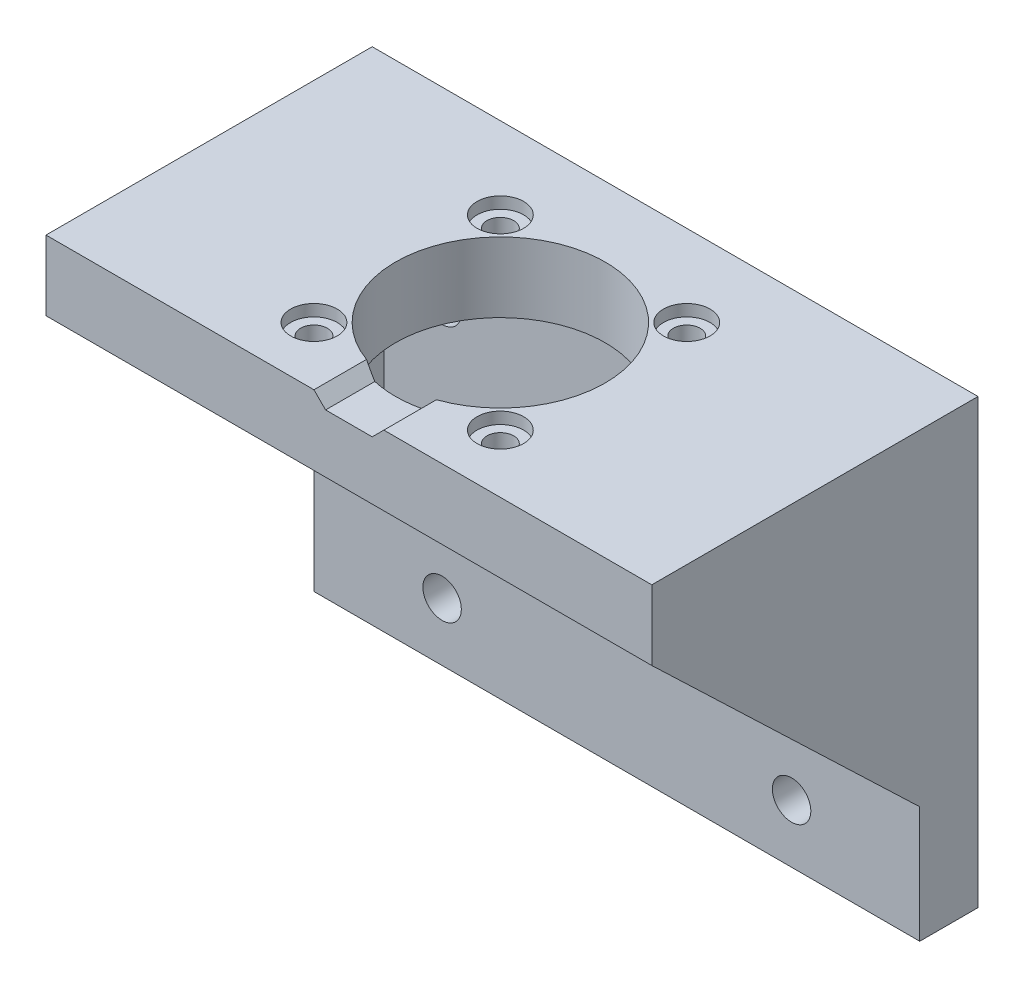
ISO-10303-21;
HEADER;
FILE_DESCRIPTION(('STEP AP214'),'2;1');
FILE_NAME('part.step','',(''),(''),'','','');
FILE_SCHEMA(('AUTOMOTIVE_DESIGN { 1 0 10303 214 1 1 1 1 }'));
ENDSEC;
DATA;
#1=APPLICATION_CONTEXT('core data for automotive mechanical design processes');
#2=APPLICATION_PROTOCOL_DEFINITION('international standard','automotive_design',2000,#1);
#3=PRODUCT_CONTEXT('',#1,'mechanical');
#4=PRODUCT('Part','Part','',(#3));
#5=PRODUCT_RELATED_PRODUCT_CATEGORY('part','',(#4));
#6=PRODUCT_DEFINITION_FORMATION('','',#4);
#7=PRODUCT_DEFINITION_CONTEXT('part definition',#1,'design');
#8=PRODUCT_DEFINITION('design','',#6,#7);
#9=PRODUCT_DEFINITION_SHAPE('','',#8);
#10=(LENGTH_UNIT() NAMED_UNIT(*) SI_UNIT(.MILLI.,.METRE.));
#11=(NAMED_UNIT(*) PLANE_ANGLE_UNIT() SI_UNIT($,.RADIAN.));
#12=(NAMED_UNIT(*) SI_UNIT($,.STERADIAN.) SOLID_ANGLE_UNIT());
#13=UNCERTAINTY_MEASURE_WITH_UNIT(LENGTH_MEASURE(1.E-05),#10,'distance_accuracy_value','');
#14=(GEOMETRIC_REPRESENTATION_CONTEXT(3) GLOBAL_UNCERTAINTY_ASSIGNED_CONTEXT((#13)) GLOBAL_UNIT_ASSIGNED_CONTEXT((#10,
#11,#12)) REPRESENTATION_CONTEXT('',''));
#15=CARTESIAN_POINT('',(0.,0.,0.));
#16=DIRECTION('',(0.,0.,1.));
#17=DIRECTION('',(1.,0.,0.));
#18=AXIS2_PLACEMENT_3D('',#15,#16,#17);
#19=CARTESIAN_POINT('',(-65.9140805289121,124.989928324475,23.0000999999999));
#20=DIRECTION('',(0.,-1.,0.));
#21=DIRECTION('',(0.,0.,-1.));
#22=AXIS2_PLACEMENT_3D('',#19,#20,#21);
#23=CYLINDRICAL_SURFACE('',#22,1.15);
#24=CARTESIAN_POINT('',(-65.9140805289121,115.737237131017,23.0000999999999));
#25=DIRECTION('',(0.,-1.,0.));
#26=DIRECTION('',(0.,0.,-1.));
#27=AXIS2_PLACEMENT_3D('',#24,#25,#26);
#28=CIRCLE('',#27,1.15);
#29=CARTESIAN_POINT('',(-65.9140805289121,115.737237131017,21.8500999999999));
#30=VERTEX_POINT('',#29);
#31=EDGE_CURVE('E234',#30,#30,#28,.T.);
#32=ORIENTED_EDGE('',*,*,#31,.T.);
#33=EDGE_LOOP('',(#32));
#34=FACE_BOUND('',#33,.T.);
#35=CARTESIAN_POINT('',(-65.9140805289121,120.737237131017,23.0000999999999));
#36=DIRECTION('',(0.,1.,0.));
#37=DIRECTION('',(0.,0.,1.));
#38=AXIS2_PLACEMENT_3D('',#35,#36,#37);
#39=CIRCLE('',#38,1.15);
#40=CARTESIAN_POINT('',(-65.9140805289121,120.737237131017,24.1500999999999));
#41=VERTEX_POINT('',#40);
#42=EDGE_CURVE('E43',#41,#41,#39,.F.);
#43=ORIENTED_EDGE('',*,*,#42,.F.);
#44=EDGE_LOOP('',(#43));
#45=FACE_BOUND('',#44,.T.);
#46=ADVANCED_FACE('F39',(#34,#45),#23,.F.);
#47=CARTESIAN_POINT('',(-49.9140805289121,124.989928324475,23.0000999999999));
#48=DIRECTION('',(0.,-1.,0.));
#49=DIRECTION('',(0.,0.,-1.));
#50=AXIS2_PLACEMENT_3D('',#47,#48,#49);
#51=CYLINDRICAL_SURFACE('',#50,1.15);
#52=CARTESIAN_POINT('',(-49.9140805289121,115.737237131017,23.0000999999999));
#53=DIRECTION('',(0.,-1.,0.));
#54=DIRECTION('',(0.,0.,-1.));
#55=AXIS2_PLACEMENT_3D('',#52,#53,#54);
#56=CIRCLE('',#55,1.15);
#57=CARTESIAN_POINT('',(-49.9140805289121,115.737237131017,21.8500999999999));
#58=VERTEX_POINT('',#57);
#59=EDGE_CURVE('E231',#58,#58,#56,.T.);
#60=ORIENTED_EDGE('',*,*,#59,.T.);
#61=EDGE_LOOP('',(#60));
#62=FACE_BOUND('',#61,.T.);
#63=CARTESIAN_POINT('',(-49.9140805289121,120.737237131017,23.0000999999999));
#64=DIRECTION('',(0.,1.,0.));
#65=DIRECTION('',(0.,0.,1.));
#66=AXIS2_PLACEMENT_3D('',#63,#64,#65);
#67=CIRCLE('',#66,1.15);
#68=CARTESIAN_POINT('',(-49.9140805289121,120.737237131017,24.1500999999999));
#69=VERTEX_POINT('',#68);
#70=EDGE_CURVE('E294',#69,#69,#67,.F.);
#71=ORIENTED_EDGE('',*,*,#70,.F.);
#72=EDGE_LOOP('',(#71));
#73=FACE_BOUND('',#72,.T.);
#74=ADVANCED_FACE('F304',(#62,#73),#51,.F.);
#75=CARTESIAN_POINT('',(-49.9140805289121,124.989928324475,7.00009999999994));
#76=DIRECTION('',(0.,-1.,0.));
#77=DIRECTION('',(0.,0.,-1.));
#78=AXIS2_PLACEMENT_3D('',#75,#76,#77);
#79=CYLINDRICAL_SURFACE('',#78,1.15);
#80=CARTESIAN_POINT('',(-49.9140805289121,115.737237131017,7.00009999999994));
#81=DIRECTION('',(0.,-1.,0.));
#82=DIRECTION('',(0.,0.,-1.));
#83=AXIS2_PLACEMENT_3D('',#80,#81,#82);
#84=CIRCLE('',#83,1.15);
#85=CARTESIAN_POINT('',(-49.9140805289121,115.737237131017,5.85009999999994));
#86=VERTEX_POINT('',#85);
#87=EDGE_CURVE('E235',#86,#86,#84,.T.);
#88=ORIENTED_EDGE('',*,*,#87,.T.);
#89=EDGE_LOOP('',(#88));
#90=FACE_BOUND('',#89,.T.);
#91=CARTESIAN_POINT('',(-49.9140805289121,120.737237131017,7.00009999999994));
#92=DIRECTION('',(0.,1.,0.));
#93=DIRECTION('',(0.,0.,1.));
#94=AXIS2_PLACEMENT_3D('',#91,#92,#93);
#95=CIRCLE('',#94,1.15);
#96=CARTESIAN_POINT('',(-49.9140805289121,120.737237131017,8.15009999999994));
#97=VERTEX_POINT('',#96);
#98=EDGE_CURVE('E291',#97,#97,#95,.F.);
#99=ORIENTED_EDGE('',*,*,#98,.F.);
#100=EDGE_LOOP('',(#99));
#101=FACE_BOUND('',#100,.T.);
#102=ADVANCED_FACE('F311',(#90,#101),#79,.F.);
#103=CARTESIAN_POINT('',(-65.9140805289121,124.989928324475,7.00009999999994));
#104=DIRECTION('',(0.,-1.,0.));
#105=DIRECTION('',(0.,0.,-1.));
#106=AXIS2_PLACEMENT_3D('',#103,#104,#105);
#107=CYLINDRICAL_SURFACE('',#106,1.15);
#108=CARTESIAN_POINT('',(-65.9140805289121,115.737237131017,7.00009999999994));
#109=DIRECTION('',(0.,-1.,0.));
#110=DIRECTION('',(0.,0.,-1.));
#111=AXIS2_PLACEMENT_3D('',#108,#109,#110);
#112=CIRCLE('',#111,1.15);
#113=CARTESIAN_POINT('',(-65.9140805289121,115.737237131017,5.85009999999994));
#114=VERTEX_POINT('',#113);
#115=EDGE_CURVE('E230',#114,#114,#112,.T.);
#116=ORIENTED_EDGE('',*,*,#115,.T.);
#117=EDGE_LOOP('',(#116));
#118=FACE_BOUND('',#117,.T.);
#119=CARTESIAN_POINT('',(-65.9140805289121,120.737237131017,7.00009999999994));
#120=DIRECTION('',(0.,1.,0.));
#121=DIRECTION('',(0.,0.,1.));
#122=AXIS2_PLACEMENT_3D('',#119,#120,#121);
#123=CIRCLE('',#122,1.15);
#124=CARTESIAN_POINT('',(-65.9140805289121,120.737237131017,8.15009999999994));
#125=VERTEX_POINT('',#124);
#126=EDGE_CURVE('E288',#125,#125,#123,.F.);
#127=ORIENTED_EDGE('',*,*,#126,.F.);
#128=EDGE_LOOP('',(#127));
#129=FACE_BOUND('',#128,.T.);
#130=ADVANCED_FACE('F316',(#118,#129),#107,.F.);
#131=CARTESIAN_POINT('',(0.,0.,5.));
#132=DIRECTION('',(0.,0.,1.));
#133=DIRECTION('',(1.,0.,0.));
#134=AXIS2_PLACEMENT_3D('',#131,#132,#133);
#135=PLANE('',#134);
#136=CARTESIAN_POINT('',(-72.9141805289121,99.737237131017,5.));
#137=DIRECTION('',(0.,0.,1.));
#138=DIRECTION('',(1.,0.,0.));
#139=AXIS2_PLACEMENT_3D('',#136,#137,#138);
#140=CIRCLE('',#139,1.65);
#141=CARTESIAN_POINT('',(-71.2641805289121,99.737237131017,5.));
#142=VERTEX_POINT('',#141);
#143=EDGE_CURVE('E167',#142,#142,#140,.T.);
#144=ORIENTED_EDGE('',*,*,#143,.F.);
#145=EDGE_LOOP('',(#144));
#146=FACE_BOUND('',#145,.T.);
#147=CARTESIAN_POINT('',(-42.9141805289121,99.737237131017,5.));
#148=DIRECTION('',(0.,0.,1.));
#149=DIRECTION('',(1.,0.,0.));
#150=AXIS2_PLACEMENT_3D('',#147,#148,#149);
#151=CIRCLE('',#150,1.65);
#152=CARTESIAN_POINT('',(-41.2641805289121,99.737237131017,5.));
#153=VERTEX_POINT('',#152);
#154=EDGE_CURVE('E158',#153,#153,#151,.T.);
#155=ORIENTED_EDGE('',*,*,#154,.F.);
#156=EDGE_LOOP('',(#155));
#157=FACE_BOUND('',#156,.T.);
#158=CARTESIAN_POINT('',(-42.9141805289121,88.737237131017,5.));
#159=DIRECTION('',(0.,0.,1.));
#160=DIRECTION('',(1.,0.,0.));
#161=AXIS2_PLACEMENT_3D('',#158,#159,#160);
#162=CIRCLE('',#161,1.65);
#163=CARTESIAN_POINT('',(-41.2641805289121,88.737237131017,5.));
#164=VERTEX_POINT('',#163);
#165=EDGE_CURVE('E185',#164,#164,#162,.T.);
#166=ORIENTED_EDGE('',*,*,#165,.F.);
#167=EDGE_LOOP('',(#166));
#168=FACE_BOUND('',#167,.T.);
#169=CARTESIAN_POINT('',(-72.9141805289121,110.737237131017,5.));
#170=DIRECTION('',(0.,0.,1.));
#171=DIRECTION('',(1.,0.,0.));
#172=AXIS2_PLACEMENT_3D('',#169,#170,#171);
#173=CIRCLE('',#172,1.65);
#174=CARTESIAN_POINT('',(-71.2641805289121,110.737237131017,5.));
#175=VERTEX_POINT('',#174);
#176=EDGE_CURVE('E178',#175,#175,#173,.T.);
#177=ORIENTED_EDGE('',*,*,#176,.F.);
#178=EDGE_LOOP('',(#177));
#179=FACE_BOUND('',#178,.T.);
#180=CARTESIAN_POINT('',(-72.9141805289121,88.737237131017,5.));
#181=DIRECTION('',(0.,0.,1.));
#182=DIRECTION('',(1.,0.,0.));
#183=AXIS2_PLACEMENT_3D('',#180,#181,#182);
#184=CIRCLE('',#183,1.65);
#185=CARTESIAN_POINT('',(-71.2641805289121,88.737237131017,5.));
#186=VERTEX_POINT('',#185);
#187=EDGE_CURVE('E166',#186,#186,#184,.T.);
#188=ORIENTED_EDGE('',*,*,#187,.F.);
#189=EDGE_LOOP('',(#188));
#190=FACE_BOUND('',#189,.T.);
#191=CARTESIAN_POINT('',(-42.9141805289121,110.737237131017,5.));
#192=DIRECTION('',(0.,0.,1.));
#193=DIRECTION('',(1.,0.,0.));
#194=AXIS2_PLACEMENT_3D('',#191,#192,#193);
#195=CIRCLE('',#194,1.65);
#196=CARTESIAN_POINT('',(-41.2641805289121,110.737237131017,5.));
#197=VERTEX_POINT('',#196);
#198=EDGE_CURVE('E184',#197,#197,#195,.T.);
#199=ORIENTED_EDGE('',*,*,#198,.F.);
#200=EDGE_LOOP('',(#199));
#201=FACE_BOUND('',#200,.T.);
#202=DIRECTION('',(0.,1.,0.));
#203=VECTOR('',#202,1.);
#204=CARTESIAN_POINT('',(-77.9141805289121,83.737237131017,5.));
#205=LINE('',#204,#203);
#206=CARTESIAN_POINT('',(-77.9141805289121,93.737237131017,5.));
#207=VERTEX_POINT('',#206);
#208=CARTESIAN_POINT('',(-77.9141805289121,115.737237131017,5.));
#209=VERTEX_POINT('',#208);
#210=EDGE_CURVE('E224',#207,#209,#205,.T.);
#211=ORIENTED_EDGE('',*,*,#210,.F.);
#212=DIRECTION('',(-1.,0.,0.));
#213=VECTOR('',#212,1.);
#214=CARTESIAN_POINT('',(-31.9141805289121,93.737237131017,5.));
#215=LINE('',#214,#213);
#216=CARTESIAN_POINT('',(-83.9141805289121,93.737237131017,5.));
#217=VERTEX_POINT('',#216);
#218=EDGE_CURVE('E215',#207,#217,#215,.T.);
#219=ORIENTED_EDGE('',*,*,#218,.T.);
#220=DIRECTION('',(0.,-1.,0.));
#221=VECTOR('',#220,1.);
#222=CARTESIAN_POINT('',(-83.9141805289121,83.737237131017,5.));
#223=LINE('',#222,#221);
#224=CARTESIAN_POINT('',(-83.9141805289121,83.737237131017,5.));
#225=VERTEX_POINT('',#224);
#226=EDGE_CURVE('E203',#217,#225,#223,.T.);
#227=ORIENTED_EDGE('',*,*,#226,.T.);
#228=DIRECTION('',(1.,0.,0.));
#229=VECTOR('',#228,1.);
#230=CARTESIAN_POINT('',(-83.9141805289121,83.737237131017,5.));
#231=LINE('',#230,#229);
#232=CARTESIAN_POINT('',(-31.9141805289121,83.737237131017,5.));
#233=VERTEX_POINT('',#232);
#234=EDGE_CURVE('E257',#225,#233,#231,.T.);
#235=ORIENTED_EDGE('',*,*,#234,.T.);
#236=DIRECTION('',(0.,-1.,0.));
#237=VECTOR('',#236,1.);
#238=CARTESIAN_POINT('',(-31.9141805289121,79.1510465858226,5.));
#239=LINE('',#238,#237);
#240=CARTESIAN_POINT('',(-31.9141805289121,93.737237131017,5.));
#241=VERTEX_POINT('',#240);
#242=EDGE_CURVE('E199',#241,#233,#239,.T.);
#243=ORIENTED_EDGE('',*,*,#242,.F.);
#244=CARTESIAN_POINT('',(-37.9141805289121,93.737237131017,5.));
#245=VERTEX_POINT('',#244);
#246=EDGE_CURVE('E211',#241,#245,#215,.T.);
#247=ORIENTED_EDGE('',*,*,#246,.T.);
#248=DIRECTION('',(0.,-1.,0.));
#249=VECTOR('',#248,1.);
#250=CARTESIAN_POINT('',(-37.9141805289121,83.737237131017,5.));
#251=LINE('',#250,#249);
#252=CARTESIAN_POINT('',(-37.9141805289121,115.737237131017,5.));
#253=VERTEX_POINT('',#252);
#254=EDGE_CURVE('E221',#253,#245,#251,.T.);
#255=ORIENTED_EDGE('',*,*,#254,.F.);
#256=DIRECTION('',(1.,0.,0.));
#257=VECTOR('',#256,1.);
#258=CARTESIAN_POINT('',(-83.9141805289121,115.737237131017,5.));
#259=LINE('',#258,#257);
#260=EDGE_CURVE('E247',#209,#253,#259,.T.);
#261=ORIENTED_EDGE('',*,*,#260,.F.);
#262=EDGE_LOOP('',(#211,#219,#227,#235,#243,#247,#255,#261));
#263=FACE_BOUND('',#262,.T.);
#264=ADVANCED_FACE('F330',(#146,#157,#168,#179,#190,#201,#263),#135,.T.);
#265=CARTESIAN_POINT('',(-83.9141805289121,115.737237131017,28.));
#266=DIRECTION('',(0.,1.,0.));
#267=DIRECTION('',(0.,0.,1.));
#268=AXIS2_PLACEMENT_3D('',#265,#266,#267);
#269=PLANE('',#268);
#270=ORIENTED_EDGE('',*,*,#115,.F.);
#271=EDGE_LOOP('',(#270));
#272=FACE_BOUND('',#271,.T.);
#273=ORIENTED_EDGE('',*,*,#87,.F.);
#274=EDGE_LOOP('',(#273));
#275=FACE_BOUND('',#274,.T.);
#276=ORIENTED_EDGE('',*,*,#59,.F.);
#277=EDGE_LOOP('',(#276));
#278=FACE_BOUND('',#277,.T.);
#279=ORIENTED_EDGE('',*,*,#31,.F.);
#280=EDGE_LOOP('',(#279));
#281=FACE_BOUND('',#280,.T.);
#282=CARTESIAN_POINT('',(-57.9140805289121,115.737237131017,15.0001));
#283=DIRECTION('',(0.,1.,0.));
#284=DIRECTION('',(0.,0.,1.));
#285=AXIS2_PLACEMENT_3D('',#282,#283,#284);
#286=CIRCLE('',#285,9.00000000000001);
#287=CARTESIAN_POINT('',(-57.9140805289121,115.737237131017,24.0001));
#288=VERTEX_POINT('',#287);
#289=EDGE_CURVE('E244',#288,#288,#286,.F.);
#290=ORIENTED_EDGE('',*,*,#289,.F.);
#291=EDGE_LOOP('',(#290));
#292=FACE_BOUND('',#291,.T.);
#293=DIRECTION('',(0.,0.,-1.));
#294=VECTOR('',#293,1.);
#295=CARTESIAN_POINT('',(-37.9141805289121,115.737237131017,60.5576411921994));
#296=LINE('',#295,#294);
#297=CARTESIAN_POINT('',(-37.9141805289121,115.737237131017,28.));
#298=VERTEX_POINT('',#297);
#299=EDGE_CURVE('E220',#298,#253,#296,.T.);
#300=ORIENTED_EDGE('',*,*,#299,.F.);
#301=DIRECTION('',(1.,0.,0.));
#302=VECTOR('',#301,1.);
#303=CARTESIAN_POINT('',(-83.9141805289121,115.737237131017,28.));
#304=LINE('',#303,#302);
#305=CARTESIAN_POINT('',(-77.9141805289121,115.737237131017,28.));
#306=VERTEX_POINT('',#305);
#307=EDGE_CURVE('E250',#306,#298,#304,.T.);
#308=ORIENTED_EDGE('',*,*,#307,.F.);
#309=DIRECTION('',(0.,0.,-1.));
#310=VECTOR('',#309,1.);
#311=CARTESIAN_POINT('',(-77.9141805289121,115.737237131017,60.5576411921994));
#312=LINE('',#311,#310);
#313=EDGE_CURVE('E227',#306,#209,#312,.T.);
#314=ORIENTED_EDGE('',*,*,#313,.T.);
#315=ORIENTED_EDGE('',*,*,#260,.T.);
#316=EDGE_LOOP('',(#300,#308,#314,#315));
#317=FACE_BOUND('',#316,.T.);
#318=ADVANCED_FACE('F326',(#272,#275,#278,#281,#292,#317),#269,.F.);
#319=CARTESIAN_POINT('',(-83.9141805289121,121.737237131017,5.));
#320=DIRECTION('',(1.,0.,0.));
#321=DIRECTION('',(0.,0.,-1.));
#322=AXIS2_PLACEMENT_3D('',#319,#320,#321);
#323=PLANE('',#322);
#324=DIRECTION('',(0.,0.,-1.));
#325=VECTOR('',#324,1.);
#326=CARTESIAN_POINT('',(-83.9141805289121,83.737237131017,5.));
#327=LINE('',#326,#325);
#328=CARTESIAN_POINT('',(-83.9141805289121,83.737237131017,0.));
#329=VERTEX_POINT('',#328);
#330=EDGE_CURVE('E274',#225,#329,#327,.T.);
#331=ORIENTED_EDGE('',*,*,#330,.F.);
#332=ORIENTED_EDGE('',*,*,#226,.F.);
#333=DIRECTION('',(0.,-0.691222645967364,-0.722641857147699));
#334=VECTOR('',#333,1.);
#335=CARTESIAN_POINT('',(-83.9141805289121,93.737237131017,5.));
#336=LINE('',#335,#334);
#337=CARTESIAN_POINT('',(-83.9141805289121,115.737237131017,28.));
#338=VERTEX_POINT('',#337);
#339=EDGE_CURVE('E196',#338,#217,#336,.T.);
#340=ORIENTED_EDGE('',*,*,#339,.F.);
#341=DIRECTION('',(0.,-1.,0.));
#342=VECTOR('',#341,1.);
#343=CARTESIAN_POINT('',(-83.9141805289121,121.737237131017,28.));
#344=LINE('',#343,#342);
#345=CARTESIAN_POINT('',(-83.9141805289121,121.737237131017,28.));
#346=VERTEX_POINT('',#345);
#347=EDGE_CURVE('E248',#346,#338,#344,.T.);
#348=ORIENTED_EDGE('',*,*,#347,.F.);
#349=DIRECTION('',(0.,0.,-1.));
#350=VECTOR('',#349,1.);
#351=CARTESIAN_POINT('',(-83.9141805289121,121.737237131017,5.));
#352=LINE('',#351,#350);
#353=CARTESIAN_POINT('',(-83.9141805289121,121.737237131017,0.));
#354=VERTEX_POINT('',#353);
#355=EDGE_CURVE('E149',#346,#354,#352,.T.);
#356=ORIENTED_EDGE('',*,*,#355,.T.);
#357=DIRECTION('',(0.,-1.,0.));
#358=VECTOR('',#357,1.);
#359=CARTESIAN_POINT('',(-83.9141805289121,121.737237131017,0.));
#360=LINE('',#359,#358);
#361=EDGE_CURVE('E254',#354,#329,#360,.T.);
#362=ORIENTED_EDGE('',*,*,#361,.T.);
#363=EDGE_LOOP('',(#331,#332,#340,#348,#356,#362));
#364=FACE_BOUND('',#363,.T.);
#365=ADVANCED_FACE('F329',(#364),#323,.F.);
#366=CARTESIAN_POINT('',(-83.9141805289121,83.737237131017,5.));
#367=DIRECTION('',(0.,1.,0.));
#368=DIRECTION('',(0.,0.,1.));
#369=AXIS2_PLACEMENT_3D('',#366,#367,#368);
#370=PLANE('',#369);
#371=DIRECTION('',(0.,0.,-1.));
#372=VECTOR('',#371,1.);
#373=CARTESIAN_POINT('',(-31.9141805289121,83.737237131017,5.));
#374=LINE('',#373,#372);
#375=CARTESIAN_POINT('',(-31.9141805289121,83.737237131017,0.));
#376=VERTEX_POINT('',#375);
#377=EDGE_CURVE('E272',#233,#376,#374,.T.);
#378=ORIENTED_EDGE('',*,*,#377,.F.);
#379=ORIENTED_EDGE('',*,*,#234,.F.);
#380=ORIENTED_EDGE('',*,*,#330,.T.);
#381=DIRECTION('',(1.,0.,0.));
#382=VECTOR('',#381,1.);
#383=CARTESIAN_POINT('',(-83.9141805289121,83.737237131017,0.));
#384=LINE('',#383,#382);
#385=EDGE_CURVE('E262',#329,#376,#384,.T.);
#386=ORIENTED_EDGE('',*,*,#385,.T.);
#387=EDGE_LOOP('',(#378,#379,#380,#386));
#388=FACE_BOUND('',#387,.T.);
#389=ADVANCED_FACE('F344',(#388),#370,.F.);
#390=CARTESIAN_POINT('',(-31.9141805289122,121.737237131017,5.));
#391=DIRECTION('',(-1.,0.,0.));
#392=DIRECTION('',(0.,-1.,0.));
#393=AXIS2_PLACEMENT_3D('',#390,#391,#392);
#394=PLANE('',#393);
#395=DIRECTION('',(0.,-0.691222645967364,-0.722641857147699));
#396=VECTOR('',#395,1.);
#397=CARTESIAN_POINT('',(-31.9141805289121,93.737237131017,5.));
#398=LINE('',#397,#396);
#399=CARTESIAN_POINT('',(-31.9141805289121,115.737237131017,28.));
#400=VERTEX_POINT('',#399);
#401=EDGE_CURVE('E202',#400,#241,#398,.T.);
#402=ORIENTED_EDGE('',*,*,#401,.T.);
#403=ORIENTED_EDGE('',*,*,#242,.T.);
#404=ORIENTED_EDGE('',*,*,#377,.T.);
#405=DIRECTION('',(0.,1.,0.));
#406=VECTOR('',#405,1.);
#407=CARTESIAN_POINT('',(-31.9141805289122,121.737237131017,0.));
#408=LINE('',#407,#406);
#409=CARTESIAN_POINT('',(-31.9141805289122,121.737237131017,0.));
#410=VERTEX_POINT('',#409);
#411=EDGE_CURVE('E265',#376,#410,#408,.T.);
#412=ORIENTED_EDGE('',*,*,#411,.T.);
#413=DIRECTION('',(0.,0.,-1.));
#414=VECTOR('',#413,1.);
#415=CARTESIAN_POINT('',(-31.9141805289122,121.737237131017,5.));
#416=LINE('',#415,#414);
#417=CARTESIAN_POINT('',(-31.9141805289121,121.737237131017,28.));
#418=VERTEX_POINT('',#417);
#419=EDGE_CURVE('E269',#418,#410,#416,.T.);
#420=ORIENTED_EDGE('',*,*,#419,.F.);
#421=DIRECTION('',(0.,1.,0.));
#422=VECTOR('',#421,1.);
#423=CARTESIAN_POINT('',(-31.9141805289121,121.737237131017,28.));
#424=LINE('',#423,#422);
#425=EDGE_CURVE('E152',#400,#418,#424,.T.);
#426=ORIENTED_EDGE('',*,*,#425,.F.);
#427=EDGE_LOOP('',(#402,#403,#404,#412,#420,#426));
#428=FACE_BOUND('',#427,.T.);
#429=ADVANCED_FACE('F340',(#428),#394,.F.);
#430=CARTESIAN_POINT('',(-83.9141805289121,121.737237131017,5.));
#431=DIRECTION('',(0.,-1.,0.));
#432=DIRECTION('',(0.,0.,-1.));
#433=AXIS2_PLACEMENT_3D('',#430,#431,#432);
#434=PLANE('',#433);
#435=CARTESIAN_POINT('',(-65.9140805289121,121.737237131017,23.0000999999999));
#436=DIRECTION('',(0.,1.,0.));
#437=DIRECTION('',(0.,0.,1.));
#438=AXIS2_PLACEMENT_3D('',#435,#436,#437);
#439=CIRCLE('',#438,2.);
#440=CARTESIAN_POINT('',(-65.9140805289121,121.737237131017,25.0000999999999));
#441=VERTEX_POINT('',#440);
#442=EDGE_CURVE('E455',#441,#441,#439,.T.);
#443=ORIENTED_EDGE('',*,*,#442,.F.);
#444=EDGE_LOOP('',(#443));
#445=FACE_BOUND('',#444,.T.);
#446=CARTESIAN_POINT('',(-49.9140805289121,121.737237131017,23.0000999999999));
#447=DIRECTION('',(0.,1.,0.));
#448=DIRECTION('',(0.,0.,1.));
#449=AXIS2_PLACEMENT_3D('',#446,#447,#448);
#450=CIRCLE('',#449,2.);
#451=CARTESIAN_POINT('',(-49.9140805289121,121.737237131017,25.0000999999999));
#452=VERTEX_POINT('',#451);
#453=EDGE_CURVE('E461',#452,#452,#450,.T.);
#454=ORIENTED_EDGE('',*,*,#453,.F.);
#455=EDGE_LOOP('',(#454));
#456=FACE_BOUND('',#455,.T.);
#457=CARTESIAN_POINT('',(-49.9140805289121,121.737237131017,7.00009999999994));
#458=DIRECTION('',(0.,1.,0.));
#459=DIRECTION('',(0.,0.,1.));
#460=AXIS2_PLACEMENT_3D('',#457,#458,#459);
#461=CIRCLE('',#460,2.);
#462=CARTESIAN_POINT('',(-49.9140805289121,121.737237131017,9.00009999999993));
#463=VERTEX_POINT('',#462);
#464=EDGE_CURVE('E467',#463,#463,#461,.T.);
#465=ORIENTED_EDGE('',*,*,#464,.F.);
#466=EDGE_LOOP('',(#465));
#467=FACE_BOUND('',#466,.T.);
#468=CARTESIAN_POINT('',(-65.9140805289121,121.737237131017,7.00009999999994));
#469=DIRECTION('',(0.,1.,0.));
#470=DIRECTION('',(0.,0.,1.));
#471=AXIS2_PLACEMENT_3D('',#468,#469,#470);
#472=CIRCLE('',#471,2.);
#473=CARTESIAN_POINT('',(-65.9140805289121,121.737237131017,9.00009999999994));
#474=VERTEX_POINT('',#473);
#475=EDGE_CURVE('E449',#474,#474,#472,.T.);
#476=ORIENTED_EDGE('',*,*,#475,.F.);
#477=EDGE_LOOP('',(#476));
#478=FACE_BOUND('',#477,.T.);
#479=CARTESIAN_POINT('',(-57.9140805289121,121.737237131017,15.0001));
#480=DIRECTION('',(0.,1.,0.));
#481=DIRECTION('',(0.,0.,1.));
#482=AXIS2_PLACEMENT_3D('',#479,#480,#481);
#483=CIRCLE('',#482,9.00000000000001);
#484=CARTESIAN_POINT('',(-54.9141805289121,121.737237131017,23.4854167289148));
#485=VERTEX_POINT('',#484);
#486=CARTESIAN_POINT('',(-60.9141805289121,121.737237131017,23.4853460182366));
#487=VERTEX_POINT('',#486);
#488=EDGE_CURVE('E242',#485,#487,#483,.T.);
#489=ORIENTED_EDGE('',*,*,#488,.F.);
#490=DIRECTION('',(0.,0.,-1.));
#491=VECTOR('',#490,1.);
#492=CARTESIAN_POINT('',(-54.9141805289121,121.737237131017,28.));
#493=LINE('',#492,#491);
#494=CARTESIAN_POINT('',(-54.9141805289121,121.737237131017,28.));
#495=VERTEX_POINT('',#494);
#496=EDGE_CURVE('E156',#495,#485,#493,.T.);
#497=ORIENTED_EDGE('',*,*,#496,.F.);
#498=DIRECTION('',(-1.,0.,0.));
#499=VECTOR('',#498,1.);
#500=CARTESIAN_POINT('',(-83.9141805289121,121.737237131017,28.));
#501=LINE('',#500,#499);
#502=EDGE_CURVE('E151',#418,#495,#501,.T.);
#503=ORIENTED_EDGE('',*,*,#502,.F.);
#504=ORIENTED_EDGE('',*,*,#419,.T.);
#505=DIRECTION('',(-1.,0.,0.));
#506=VECTOR('',#505,1.);
#507=CARTESIAN_POINT('',(-83.9141805289121,121.737237131017,0.));
#508=LINE('',#507,#506);
#509=EDGE_CURVE('E259',#410,#354,#508,.T.);
#510=ORIENTED_EDGE('',*,*,#509,.T.);
#511=ORIENTED_EDGE('',*,*,#355,.F.);
#512=CARTESIAN_POINT('',(-60.9141805289121,121.737237131017,28.));
#513=VERTEX_POINT('',#512);
#514=EDGE_CURVE('E137',#513,#346,#501,.T.);
#515=ORIENTED_EDGE('',*,*,#514,.F.);
#516=DIRECTION('',(0.,0.,1.));
#517=VECTOR('',#516,1.);
#518=CARTESIAN_POINT('',(-60.9141805289121,121.737237131017,28.));
#519=LINE('',#518,#517);
#520=EDGE_CURVE('E146',#487,#513,#519,.T.);
#521=ORIENTED_EDGE('',*,*,#520,.F.);
#522=EDGE_LOOP('',(#489,#497,#503,#504,#510,#511,#515,#521));
#523=FACE_BOUND('',#522,.T.);
#524=ADVANCED_FACE('F145',(#445,#456,#467,#478,#523),#434,.F.);
#525=CARTESIAN_POINT('',(0.,0.,0.));
#526=DIRECTION('',(0.,0.,1.));
#527=DIRECTION('',(1.,0.,0.));
#528=AXIS2_PLACEMENT_3D('',#525,#526,#527);
#529=PLANE('',#528);
#530=CARTESIAN_POINT('',(-72.9141805289121,99.737237131017,0.));
#531=DIRECTION('',(0.,0.,1.));
#532=DIRECTION('',(1.,0.,0.));
#533=AXIS2_PLACEMENT_3D('',#530,#531,#532);
#534=CIRCLE('',#533,1.65);
#535=CARTESIAN_POINT('',(-71.2641805289121,99.737237131017,0.));
#536=VERTEX_POINT('',#535);
#537=EDGE_CURVE('E163',#536,#536,#534,.T.);
#538=ORIENTED_EDGE('',*,*,#537,.T.);
#539=EDGE_LOOP('',(#538));
#540=FACE_BOUND('',#539,.T.);
#541=CARTESIAN_POINT('',(-42.9141805289121,99.737237131017,0.));
#542=DIRECTION('',(0.,0.,1.));
#543=DIRECTION('',(1.,0.,0.));
#544=AXIS2_PLACEMENT_3D('',#541,#542,#543);
#545=CIRCLE('',#544,1.65);
#546=CARTESIAN_POINT('',(-41.2641805289121,99.737237131017,0.));
#547=VERTEX_POINT('',#546);
#548=EDGE_CURVE('E170',#547,#547,#545,.T.);
#549=ORIENTED_EDGE('',*,*,#548,.T.);
#550=EDGE_LOOP('',(#549));
#551=FACE_BOUND('',#550,.T.);
#552=CARTESIAN_POINT('',(-42.9141805289121,88.737237131017,0.));
#553=DIRECTION('',(0.,0.,1.));
#554=DIRECTION('',(1.,0.,0.));
#555=AXIS2_PLACEMENT_3D('',#552,#553,#554);
#556=CIRCLE('',#555,1.65);
#557=CARTESIAN_POINT('',(-41.2641805289121,88.737237131017,0.));
#558=VERTEX_POINT('',#557);
#559=EDGE_CURVE('E181',#558,#558,#556,.T.);
#560=ORIENTED_EDGE('',*,*,#559,.T.);
#561=EDGE_LOOP('',(#560));
#562=FACE_BOUND('',#561,.T.);
#563=CARTESIAN_POINT('',(-72.9141805289121,110.737237131017,0.));
#564=DIRECTION('',(0.,0.,1.));
#565=DIRECTION('',(1.,0.,0.));
#566=AXIS2_PLACEMENT_3D('',#563,#564,#565);
#567=CIRCLE('',#566,1.65);
#568=CARTESIAN_POINT('',(-71.2641805289121,110.737237131017,0.));
#569=VERTEX_POINT('',#568);
#570=EDGE_CURVE('E188',#569,#569,#567,.T.);
#571=ORIENTED_EDGE('',*,*,#570,.T.);
#572=EDGE_LOOP('',(#571));
#573=FACE_BOUND('',#572,.T.);
#574=CARTESIAN_POINT('',(-72.9141805289121,88.737237131017,0.));
#575=DIRECTION('',(0.,0.,1.));
#576=DIRECTION('',(1.,0.,0.));
#577=AXIS2_PLACEMENT_3D('',#574,#575,#576);
#578=CIRCLE('',#577,1.65);
#579=CARTESIAN_POINT('',(-71.2641805289121,88.737237131017,0.));
#580=VERTEX_POINT('',#579);
#581=EDGE_CURVE('E175',#580,#580,#578,.T.);
#582=ORIENTED_EDGE('',*,*,#581,.T.);
#583=EDGE_LOOP('',(#582));
#584=FACE_BOUND('',#583,.T.);
#585=CARTESIAN_POINT('',(-42.9141805289121,110.737237131017,0.));
#586=DIRECTION('',(0.,0.,1.));
#587=DIRECTION('',(1.,0.,0.));
#588=AXIS2_PLACEMENT_3D('',#585,#586,#587);
#589=CIRCLE('',#588,1.65);
#590=CARTESIAN_POINT('',(-41.2641805289121,110.737237131017,0.));
#591=VERTEX_POINT('',#590);
#592=EDGE_CURVE('E193',#591,#591,#589,.T.);
#593=ORIENTED_EDGE('',*,*,#592,.T.);
#594=EDGE_LOOP('',(#593));
#595=FACE_BOUND('',#594,.T.);
#596=ORIENTED_EDGE('',*,*,#361,.F.);
#597=ORIENTED_EDGE('',*,*,#509,.F.);
#598=ORIENTED_EDGE('',*,*,#411,.F.);
#599=ORIENTED_EDGE('',*,*,#385,.F.);
#600=EDGE_LOOP('',(#596,#597,#598,#599));
#601=FACE_BOUND('',#600,.T.);
#602=ADVANCED_FACE('F325',(#540,#551,#562,#573,#584,#595,#601),#529,.F.);
#603=CARTESIAN_POINT('',(0.,0.,28.));
#604=DIRECTION('',(0.,0.,1.));
#605=DIRECTION('',(1.,0.,0.));
#606=AXIS2_PLACEMENT_3D('',#603,#604,#605);
#607=PLANE('',#606);
#608=ORIENTED_EDGE('',*,*,#502,.T.);
#609=DIRECTION('',(-0.707106781186555,-0.70710678118654,0.));
#610=VECTOR('',#609,1.);
#611=CARTESIAN_POINT('',(-55.9141805289121,120.737237131017,28.));
#612=LINE('',#611,#610);
#613=CARTESIAN_POINT('',(-55.9141805289121,120.737237131017,28.));
#614=VERTEX_POINT('',#613);
#615=EDGE_CURVE('E11',#495,#614,#612,.T.);
#616=ORIENTED_EDGE('',*,*,#615,.T.);
#617=DIRECTION('',(1.,0.,0.));
#618=VECTOR('',#617,1.);
#619=CARTESIAN_POINT('',(-54.9141805289121,120.737237131017,28.));
#620=LINE('',#619,#618);
#621=CARTESIAN_POINT('',(-59.9141805289121,120.737237131017,28.));
#622=VERTEX_POINT('',#621);
#623=EDGE_CURVE('E139',#622,#614,#620,.T.);
#624=ORIENTED_EDGE('',*,*,#623,.F.);
#625=DIRECTION('',(-0.70710678118655,0.707106781186545,0.));
#626=VECTOR('',#625,1.);
#627=CARTESIAN_POINT('',(-59.9141805289121,120.737237131017,28.));
#628=LINE('',#627,#626);
#629=EDGE_CURVE('E62',#622,#513,#628,.T.);
#630=ORIENTED_EDGE('',*,*,#629,.T.);
#631=ORIENTED_EDGE('',*,*,#514,.T.);
#632=ORIENTED_EDGE('',*,*,#347,.T.);
#633=DIRECTION('',(-1.,0.,0.));
#634=VECTOR('',#633,1.);
#635=CARTESIAN_POINT('',(-31.9141805289121,115.737237131017,28.));
#636=LINE('',#635,#634);
#637=EDGE_CURVE('E206',#306,#338,#636,.T.);
#638=ORIENTED_EDGE('',*,*,#637,.F.);
#639=ORIENTED_EDGE('',*,*,#307,.T.);
#640=EDGE_CURVE('E216',#400,#298,#636,.T.);
#641=ORIENTED_EDGE('',*,*,#640,.F.);
#642=ORIENTED_EDGE('',*,*,#425,.T.);
#643=EDGE_LOOP('',(#608,#616,#624,#630,#631,#632,#638,#639,#641,#642));
#644=FACE_BOUND('',#643,.T.);
#645=ADVANCED_FACE('F135',(#644),#607,.T.);
#646=CARTESIAN_POINT('',(-57.9140805289121,90.2813930083013,15.0001));
#647=DIRECTION('',(0.,1.,0.));
#648=DIRECTION('',(0.,0.,1.));
#649=AXIS2_PLACEMENT_3D('',#646,#647,#648);
#650=CYLINDRICAL_SURFACE('',#649,9.00000000000001);
#651=ORIENTED_EDGE('',*,*,#289,.T.);
#652=EDGE_LOOP('',(#651));
#653=FACE_BOUND('',#652,.T.);
#654=CARTESIAN_POINT('',(-57.9140805289121,120.737237131017,15.0001));
#655=DIRECTION('',(0.,1.,0.));
#656=DIRECTION('',(0.,0.,1.));
#657=AXIS2_PLACEMENT_3D('',#654,#655,#656);
#658=CIRCLE('',#657,9.00000000000001);
#659=CARTESIAN_POINT('',(-55.9141805289121,120.737237131017,23.775087178908));
#660=VERTEX_POINT('',#659);
#661=CARTESIAN_POINT('',(-59.9141805289121,120.737237131017,23.7750415946774));
#662=VERTEX_POINT('',#661);
#663=EDGE_CURVE('E279',#660,#662,#658,.F.);
#664=ORIENTED_EDGE('',*,*,#663,.F.);
#665=CARTESIAN_POINT('',(-57.9140805289121,118.737337131017,15.0001));
#666=DIRECTION('',(0.70710678118654,-0.707106781186555,0.));
#667=DIRECTION('',(0.707106781186555,0.70710678118654,0.));
#668=AXIS2_PLACEMENT_3D('',#665,#666,#667);
#669=ELLIPSE('',#668,12.7279220613577,9.00000000000001);
#670=EDGE_CURVE('E48',#660,#485,#669,.F.);
#671=ORIENTED_EDGE('',*,*,#670,.T.);
#672=ORIENTED_EDGE('',*,*,#488,.T.);
#673=CARTESIAN_POINT('',(-57.9140805289121,118.737137131017,15.0001));
#674=DIRECTION('',(-0.707106781186545,-0.70710678118655,0.));
#675=DIRECTION('',(-0.70710678118655,0.707106781186545,0.));
#676=AXIS2_PLACEMENT_3D('',#673,#674,#675);
#677=ELLIPSE('',#676,12.7279220613578,9.00000000000001);
#678=EDGE_CURVE('E140',#487,#662,#677,.F.);
#679=ORIENTED_EDGE('',*,*,#678,.T.);
#680=EDGE_LOOP('',(#664,#671,#672,#679));
#681=FACE_BOUND('',#680,.T.);
#682=ADVANCED_FACE('F318',(#653,#681),#650,.F.);
#683=CARTESIAN_POINT('',(-77.9141805289121,83.737237131017,60.5576411921994));
#684=DIRECTION('',(-1.,0.,0.));
#685=DIRECTION('',(0.,0.,1.));
#686=AXIS2_PLACEMENT_3D('',#683,#684,#685);
#687=PLANE('',#686);
#688=ORIENTED_EDGE('',*,*,#313,.F.);
#689=DIRECTION('',(0.,-0.691222645967364,-0.722641857147699));
#690=VECTOR('',#689,1.);
#691=CARTESIAN_POINT('',(-77.9141805289121,116.710747933833,29.0177612938534));
#692=LINE('',#691,#690);
#693=EDGE_CURVE('E214',#306,#207,#692,.T.);
#694=ORIENTED_EDGE('',*,*,#693,.T.);
#695=ORIENTED_EDGE('',*,*,#210,.T.);
#696=EDGE_LOOP('',(#688,#694,#695));
#697=FACE_BOUND('',#696,.T.);
#698=ADVANCED_FACE('F321',(#697),#687,.F.);
#699=CARTESIAN_POINT('',(-37.9141805289121,83.737237131017,60.5576411921994));
#700=DIRECTION('',(1.,0.,0.));
#701=DIRECTION('',(0.,0.,-1.));
#702=AXIS2_PLACEMENT_3D('',#699,#700,#701);
#703=PLANE('',#702);
#704=ORIENTED_EDGE('',*,*,#254,.T.);
#705=DIRECTION('',(0.,0.691222645967364,0.722641857147699));
#706=VECTOR('',#705,1.);
#707=CARTESIAN_POINT('',(-37.9141805289121,116.710747933833,29.0177612938534));
#708=LINE('',#707,#706);
#709=EDGE_CURVE('E276',#245,#298,#708,.T.);
#710=ORIENTED_EDGE('',*,*,#709,.T.);
#711=ORIENTED_EDGE('',*,*,#299,.T.);
#712=EDGE_LOOP('',(#704,#710,#711));
#713=FACE_BOUND('',#712,.T.);
#714=ADVANCED_FACE('F396',(#713),#703,.F.);
#715=CARTESIAN_POINT('',(-31.9141805289121,93.737237131017,5.));
#716=DIRECTION('',(0.,0.722641857147699,-0.691222645967364));
#717=DIRECTION('',(0.,0.691222645967364,0.722641857147699));
#718=AXIS2_PLACEMENT_3D('',#715,#716,#717);
#719=PLANE('',#718);
#720=ORIENTED_EDGE('',*,*,#246,.F.);
#721=ORIENTED_EDGE('',*,*,#401,.F.);
#722=ORIENTED_EDGE('',*,*,#640,.T.);
#723=ORIENTED_EDGE('',*,*,#709,.F.);
#724=EDGE_LOOP('',(#720,#721,#722,#723));
#725=FACE_BOUND('',#724,.T.);
#726=ADVANCED_FACE('F394',(#725),#719,.F.);
#727=ORIENTED_EDGE('',*,*,#637,.T.);
#728=ORIENTED_EDGE('',*,*,#339,.T.);
#729=ORIENTED_EDGE('',*,*,#218,.F.);
#730=ORIENTED_EDGE('',*,*,#693,.F.);
#731=EDGE_LOOP('',(#727,#728,#729,#730));
#732=FACE_BOUND('',#731,.T.);
#733=ADVANCED_FACE('F390',(#732),#719,.F.);
#734=CARTESIAN_POINT('',(-42.9141805289121,110.737237131017,0.));
#735=DIRECTION('',(0.,0.,1.));
#736=DIRECTION('',(1.,0.,0.));
#737=AXIS2_PLACEMENT_3D('',#734,#735,#736);
#738=CYLINDRICAL_SURFACE('',#737,1.65);
#739=ORIENTED_EDGE('',*,*,#592,.F.);
#740=EDGE_LOOP('',(#739));
#741=FACE_BOUND('',#740,.T.);
#742=ORIENTED_EDGE('',*,*,#198,.T.);
#743=EDGE_LOOP('',(#742));
#744=FACE_BOUND('',#743,.T.);
#745=ADVANCED_FACE('F380',(#741,#744),#738,.F.);
#746=CARTESIAN_POINT('',(-72.9141805289121,88.737237131017,0.));
#747=DIRECTION('',(0.,0.,1.));
#748=DIRECTION('',(1.,0.,0.));
#749=AXIS2_PLACEMENT_3D('',#746,#747,#748);
#750=CYLINDRICAL_SURFACE('',#749,1.65);
#751=ORIENTED_EDGE('',*,*,#581,.F.);
#752=EDGE_LOOP('',(#751));
#753=FACE_BOUND('',#752,.T.);
#754=ORIENTED_EDGE('',*,*,#187,.T.);
#755=EDGE_LOOP('',(#754));
#756=FACE_BOUND('',#755,.T.);
#757=ADVANCED_FACE('F376',(#753,#756),#750,.F.);
#758=CARTESIAN_POINT('',(-72.9141805289121,110.737237131017,0.));
#759=DIRECTION('',(0.,0.,1.));
#760=DIRECTION('',(1.,0.,0.));
#761=AXIS2_PLACEMENT_3D('',#758,#759,#760);
#762=CYLINDRICAL_SURFACE('',#761,1.65);
#763=ORIENTED_EDGE('',*,*,#570,.F.);
#764=EDGE_LOOP('',(#763));
#765=FACE_BOUND('',#764,.T.);
#766=ORIENTED_EDGE('',*,*,#176,.T.);
#767=EDGE_LOOP('',(#766));
#768=FACE_BOUND('',#767,.T.);
#769=ADVANCED_FACE('F379',(#765,#768),#762,.F.);
#770=CARTESIAN_POINT('',(-42.9141805289121,88.737237131017,0.));
#771=DIRECTION('',(0.,0.,1.));
#772=DIRECTION('',(1.,0.,0.));
#773=AXIS2_PLACEMENT_3D('',#770,#771,#772);
#774=CYLINDRICAL_SURFACE('',#773,1.65);
#775=ORIENTED_EDGE('',*,*,#559,.F.);
#776=EDGE_LOOP('',(#775));
#777=FACE_BOUND('',#776,.T.);
#778=ORIENTED_EDGE('',*,*,#165,.T.);
#779=EDGE_LOOP('',(#778));
#780=FACE_BOUND('',#779,.T.);
#781=ADVANCED_FACE('F374',(#777,#780),#774,.F.);
#782=CARTESIAN_POINT('',(-42.9141805289121,99.737237131017,0.));
#783=DIRECTION('',(0.,0.,1.));
#784=DIRECTION('',(1.,0.,0.));
#785=AXIS2_PLACEMENT_3D('',#782,#783,#784);
#786=CYLINDRICAL_SURFACE('',#785,1.65);
#787=ORIENTED_EDGE('',*,*,#548,.F.);
#788=EDGE_LOOP('',(#787));
#789=FACE_BOUND('',#788,.T.);
#790=ORIENTED_EDGE('',*,*,#154,.T.);
#791=EDGE_LOOP('',(#790));
#792=FACE_BOUND('',#791,.T.);
#793=ADVANCED_FACE('F365',(#789,#792),#786,.F.);
#794=CARTESIAN_POINT('',(-72.9141805289121,99.737237131017,0.));
#795=DIRECTION('',(0.,0.,1.));
#796=DIRECTION('',(1.,0.,0.));
#797=AXIS2_PLACEMENT_3D('',#794,#795,#796);
#798=CYLINDRICAL_SURFACE('',#797,1.65);
#799=ORIENTED_EDGE('',*,*,#537,.F.);
#800=EDGE_LOOP('',(#799));
#801=FACE_BOUND('',#800,.T.);
#802=ORIENTED_EDGE('',*,*,#143,.T.);
#803=EDGE_LOOP('',(#802));
#804=FACE_BOUND('',#803,.T.);
#805=ADVANCED_FACE('F359',(#801,#804),#798,.F.);
#806=CARTESIAN_POINT('',(0.,120.737237131017,0.));
#807=DIRECTION('',(0.,1.,0.));
#808=DIRECTION('',(0.,0.,1.));
#809=AXIS2_PLACEMENT_3D('',#806,#807,#808);
#810=PLANE('',#809);
#811=ORIENTED_EDGE('',*,*,#663,.T.);
#812=DIRECTION('',(0.,0.,1.));
#813=VECTOR('',#812,1.);
#814=CARTESIAN_POINT('',(-59.9141805289121,120.737237131017,0.));
#815=LINE('',#814,#813);
#816=EDGE_CURVE('E141',#662,#622,#815,.T.);
#817=ORIENTED_EDGE('',*,*,#816,.T.);
#818=ORIENTED_EDGE('',*,*,#623,.T.);
#819=DIRECTION('',(0.,0.,-1.));
#820=VECTOR('',#819,1.);
#821=CARTESIAN_POINT('',(-55.9141805289121,120.737237131017,0.));
#822=LINE('',#821,#820);
#823=EDGE_CURVE('E282',#614,#660,#822,.T.);
#824=ORIENTED_EDGE('',*,*,#823,.T.);
#825=EDGE_LOOP('',(#811,#817,#818,#824));
#826=FACE_BOUND('',#825,.T.);
#827=ADVANCED_FACE('F352',(#826),#810,.T.);
#828=CARTESIAN_POINT('',(-59.9141805289121,120.737237131017,0.));
#829=DIRECTION('',(-0.707106781186545,-0.70710678118655,0.));
#830=DIRECTION('',(0.,0.,1.));
#831=AXIS2_PLACEMENT_3D('',#828,#829,#830);
#832=PLANE('',#831);
#833=ORIENTED_EDGE('',*,*,#678,.F.);
#834=ORIENTED_EDGE('',*,*,#520,.T.);
#835=ORIENTED_EDGE('',*,*,#629,.F.);
#836=ORIENTED_EDGE('',*,*,#816,.F.);
#837=EDGE_LOOP('',(#833,#834,#835,#836));
#838=FACE_BOUND('',#837,.T.);
#839=ADVANCED_FACE('F155',(#838),#832,.F.);
#840=CARTESIAN_POINT('',(-55.9141805289121,120.737237131017,0.));
#841=DIRECTION('',(0.70710678118654,-0.707106781186555,0.));
#842=DIRECTION('',(0.,0.,-1.));
#843=AXIS2_PLACEMENT_3D('',#840,#841,#842);
#844=PLANE('',#843);
#845=ORIENTED_EDGE('',*,*,#615,.F.);
#846=ORIENTED_EDGE('',*,*,#496,.T.);
#847=ORIENTED_EDGE('',*,*,#670,.F.);
#848=ORIENTED_EDGE('',*,*,#823,.F.);
#849=EDGE_LOOP('',(#845,#846,#847,#848));
#850=FACE_BOUND('',#849,.T.);
#851=ADVANCED_FACE('F41',(#850),#844,.F.);
#852=CARTESIAN_POINT('',(-65.9140805289121,120.737237131017,7.00009999999994));
#853=DIRECTION('',(0.,1.,0.));
#854=DIRECTION('',(0.,0.,1.));
#855=AXIS2_PLACEMENT_3D('',#852,#853,#854);
#856=PLANE('',#855);
#857=CARTESIAN_POINT('',(-65.9140805289121,120.737237131017,7.00009999999994));
#858=DIRECTION('',(0.,1.,0.));
#859=DIRECTION('',(0.,0.,1.));
#860=AXIS2_PLACEMENT_3D('',#857,#858,#859);
#861=CIRCLE('',#860,2.);
#862=CARTESIAN_POINT('',(-65.9140805289121,120.737237131017,9.00009999999994));
#863=VERTEX_POINT('',#862);
#864=EDGE_CURVE('E292',#863,#863,#861,.T.);
#865=ORIENTED_EDGE('',*,*,#864,.T.);
#866=EDGE_LOOP('',(#865));
#867=FACE_BOUND('',#866,.T.);
#868=ORIENTED_EDGE('',*,*,#126,.T.);
#869=EDGE_LOOP('',(#868));
#870=FACE_BOUND('',#869,.T.);
#871=ADVANCED_FACE('F357',(#867,#870),#856,.T.);
#872=CARTESIAN_POINT('',(-65.9140805289121,120.737237131017,7.00009999999994));
#873=DIRECTION('',(0.,1.,0.));
#874=DIRECTION('',(0.,0.,1.));
#875=AXIS2_PLACEMENT_3D('',#872,#873,#874);
#876=CYLINDRICAL_SURFACE('',#875,2.);
#877=ORIENTED_EDGE('',*,*,#864,.F.);
#878=EDGE_LOOP('',(#877));
#879=FACE_BOUND('',#878,.T.);
#880=ORIENTED_EDGE('',*,*,#475,.T.);
#881=EDGE_LOOP('',(#880));
#882=FACE_BOUND('',#881,.T.);
#883=ADVANCED_FACE('F369',(#879,#882),#876,.F.);
#884=CARTESIAN_POINT('',(-49.9140805289121,120.737237131017,7.00009999999994));
#885=DIRECTION('',(0.,1.,0.));
#886=DIRECTION('',(0.,0.,1.));
#887=AXIS2_PLACEMENT_3D('',#884,#885,#886);
#888=PLANE('',#887);
#889=CARTESIAN_POINT('',(-49.9140805289121,120.737237131017,7.00009999999994));
#890=DIRECTION('',(0.,1.,0.));
#891=DIRECTION('',(0.,0.,1.));
#892=AXIS2_PLACEMENT_3D('',#889,#890,#891);
#893=CIRCLE('',#892,2.);
#894=CARTESIAN_POINT('',(-49.9140805289121,120.737237131017,9.00009999999993));
#895=VERTEX_POINT('',#894);
#896=EDGE_CURVE('E452',#895,#895,#893,.T.);
#897=ORIENTED_EDGE('',*,*,#896,.T.);
#898=EDGE_LOOP('',(#897));
#899=FACE_BOUND('',#898,.T.);
#900=ORIENTED_EDGE('',*,*,#98,.T.);
#901=EDGE_LOOP('',(#900));
#902=FACE_BOUND('',#901,.T.);
#903=ADVANCED_FACE('F412',(#899,#902),#888,.T.);
#904=CARTESIAN_POINT('',(-49.9140805289121,120.737237131017,7.00009999999994));
#905=DIRECTION('',(0.,1.,0.));
#906=DIRECTION('',(0.,0.,1.));
#907=AXIS2_PLACEMENT_3D('',#904,#905,#906);
#908=CYLINDRICAL_SURFACE('',#907,2.);
#909=ORIENTED_EDGE('',*,*,#896,.F.);
#910=EDGE_LOOP('',(#909));
#911=FACE_BOUND('',#910,.T.);
#912=ORIENTED_EDGE('',*,*,#464,.T.);
#913=EDGE_LOOP('',(#912));
#914=FACE_BOUND('',#913,.T.);
#915=ADVANCED_FACE('F414',(#911,#914),#908,.F.);
#916=CARTESIAN_POINT('',(-49.9140805289121,120.737237131017,23.0000999999999));
#917=DIRECTION('',(0.,1.,0.));
#918=DIRECTION('',(0.,0.,1.));
#919=AXIS2_PLACEMENT_3D('',#916,#917,#918);
#920=PLANE('',#919);
#921=CARTESIAN_POINT('',(-49.9140805289121,120.737237131017,23.0000999999999));
#922=DIRECTION('',(0.,1.,0.));
#923=DIRECTION('',(0.,0.,1.));
#924=AXIS2_PLACEMENT_3D('',#921,#922,#923);
#925=CIRCLE('',#924,2.);
#926=CARTESIAN_POINT('',(-49.9140805289121,120.737237131017,25.0000999999999));
#927=VERTEX_POINT('',#926);
#928=EDGE_CURVE('E464',#927,#927,#925,.T.);
#929=ORIENTED_EDGE('',*,*,#928,.T.);
#930=EDGE_LOOP('',(#929));
#931=FACE_BOUND('',#930,.T.);
#932=ORIENTED_EDGE('',*,*,#70,.T.);
#933=EDGE_LOOP('',(#932));
#934=FACE_BOUND('',#933,.T.);
#935=ADVANCED_FACE('F421',(#931,#934),#920,.T.);
#936=CARTESIAN_POINT('',(-49.9140805289121,120.737237131017,23.0000999999999));
#937=DIRECTION('',(0.,1.,0.));
#938=DIRECTION('',(0.,0.,1.));
#939=AXIS2_PLACEMENT_3D('',#936,#937,#938);
#940=CYLINDRICAL_SURFACE('',#939,2.);
#941=ORIENTED_EDGE('',*,*,#928,.F.);
#942=EDGE_LOOP('',(#941));
#943=FACE_BOUND('',#942,.T.);
#944=ORIENTED_EDGE('',*,*,#453,.T.);
#945=EDGE_LOOP('',(#944));
#946=FACE_BOUND('',#945,.T.);
#947=ADVANCED_FACE('F429',(#943,#946),#940,.F.);
#948=CARTESIAN_POINT('',(-65.9140805289121,120.737237131017,23.0000999999999));
#949=DIRECTION('',(0.,1.,0.));
#950=DIRECTION('',(0.,0.,1.));
#951=AXIS2_PLACEMENT_3D('',#948,#949,#950);
#952=PLANE('',#951);
#953=CARTESIAN_POINT('',(-65.9140805289121,120.737237131017,23.0000999999999));
#954=DIRECTION('',(0.,1.,0.));
#955=DIRECTION('',(0.,0.,1.));
#956=AXIS2_PLACEMENT_3D('',#953,#954,#955);
#957=CIRCLE('',#956,2.);
#958=CARTESIAN_POINT('',(-65.9140805289121,120.737237131017,25.0000999999999));
#959=VERTEX_POINT('',#958);
#960=EDGE_CURVE('E458',#959,#959,#957,.T.);
#961=ORIENTED_EDGE('',*,*,#960,.T.);
#962=EDGE_LOOP('',(#961));
#963=FACE_BOUND('',#962,.T.);
#964=ORIENTED_EDGE('',*,*,#42,.T.);
#965=EDGE_LOOP('',(#964));
#966=FACE_BOUND('',#965,.T.);
#967=ADVANCED_FACE('F301',(#963,#966),#952,.T.);
#968=CARTESIAN_POINT('',(-65.9140805289121,120.737237131017,23.0000999999999));
#969=DIRECTION('',(0.,1.,0.));
#970=DIRECTION('',(0.,0.,1.));
#971=AXIS2_PLACEMENT_3D('',#968,#969,#970);
#972=CYLINDRICAL_SURFACE('',#971,2.);
#973=ORIENTED_EDGE('',*,*,#960,.F.);
#974=EDGE_LOOP('',(#973));
#975=FACE_BOUND('',#974,.T.);
#976=ORIENTED_EDGE('',*,*,#442,.T.);
#977=EDGE_LOOP('',(#976));
#978=FACE_BOUND('',#977,.T.);
#979=ADVANCED_FACE('F436',(#975,#978),#972,.F.);
#980=CLOSED_SHELL('',(#46,#74,#102,#130,#264,#318,#365,#389,#429,#524,#602,#645,#682,#698,#714,
#726,#733,#745,#757,#769,#781,#793,#805,#827,#839,#851,#871,#883,#903,#915,#935,#947,#967,#979));
#981=MANIFOLD_SOLID_BREP('B2',#980);
#982=ADVANCED_BREP_SHAPE_REPRESENTATION('',(#18,#981),#14);
#983=SHAPE_DEFINITION_REPRESENTATION(#9,#982);
ENDSEC;
END-ISO-10303-21;
